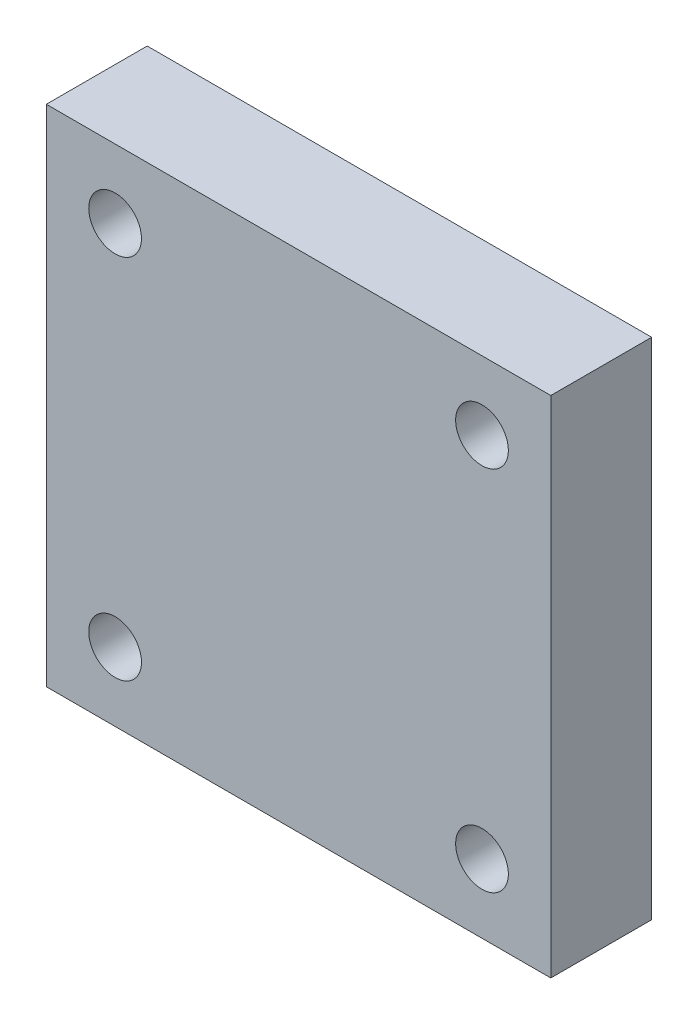
ISO-10303-21;
HEADER;
FILE_DESCRIPTION(('STEP AP214'),'2;1');
FILE_NAME('part.step','',(''),(''),'','','');
FILE_SCHEMA(('AUTOMOTIVE_DESIGN { 1 0 10303 214 1 1 1 1 }'));
ENDSEC;
DATA;
#1=APPLICATION_CONTEXT('core data for automotive mechanical design processes');
#2=APPLICATION_PROTOCOL_DEFINITION('international standard','automotive_design',2000,#1);
#3=PRODUCT_CONTEXT('',#1,'mechanical');
#4=PRODUCT('Part','Part','',(#3));
#5=PRODUCT_RELATED_PRODUCT_CATEGORY('part','',(#4));
#6=PRODUCT_DEFINITION_FORMATION('','',#4);
#7=PRODUCT_DEFINITION_CONTEXT('part definition',#1,'design');
#8=PRODUCT_DEFINITION('design','',#6,#7);
#9=PRODUCT_DEFINITION_SHAPE('','',#8);
#10=(LENGTH_UNIT() NAMED_UNIT(*) SI_UNIT(.MILLI.,.METRE.));
#11=(NAMED_UNIT(*) PLANE_ANGLE_UNIT() SI_UNIT($,.RADIAN.));
#12=(NAMED_UNIT(*) SI_UNIT($,.STERADIAN.) SOLID_ANGLE_UNIT());
#13=UNCERTAINTY_MEASURE_WITH_UNIT(LENGTH_MEASURE(1.E-05),#10,'distance_accuracy_value','');
#14=(GEOMETRIC_REPRESENTATION_CONTEXT(3) GLOBAL_UNCERTAINTY_ASSIGNED_CONTEXT((#13)) GLOBAL_UNIT_ASSIGNED_CONTEXT((#10,
#11,#12)) REPRESENTATION_CONTEXT('',''));
#15=CARTESIAN_POINT('',(0.,0.,0.));
#16=DIRECTION('',(0.,0.,1.));
#17=DIRECTION('',(1.,0.,0.));
#18=AXIS2_PLACEMENT_3D('',#15,#16,#17);
#19=CARTESIAN_POINT('',(0.,0.,5.588));
#20=DIRECTION('',(0.,0.,1.));
#21=DIRECTION('',(1.,0.,0.));
#22=AXIS2_PLACEMENT_3D('',#19,#20,#21);
#23=PLANE('',#22);
#24=CARTESIAN_POINT('',(10.16,-10.16,5.588));
#25=DIRECTION('',(0.,0.,1.));
#26=DIRECTION('',(-1.,0.,0.));
#27=AXIS2_PLACEMENT_3D('',#24,#25,#26);
#28=CIRCLE('',#27,1.4605);
#29=CARTESIAN_POINT('',(8.6995,-10.16,5.588));
#30=VERTEX_POINT('',#29);
#31=EDGE_CURVE('E148',#30,#30,#28,.T.);
#32=ORIENTED_EDGE('',*,*,#31,.F.);
#33=EDGE_LOOP('',(#32));
#34=FACE_BOUND('',#33,.T.);
#35=CARTESIAN_POINT('',(-10.16,-10.16,5.588));
#36=DIRECTION('',(0.,0.,1.));
#37=DIRECTION('',(1.,0.,0.));
#38=AXIS2_PLACEMENT_3D('',#35,#36,#37);
#39=CIRCLE('',#38,1.4605);
#40=CARTESIAN_POINT('',(-8.6995,-10.16,5.588));
#41=VERTEX_POINT('',#40);
#42=EDGE_CURVE('E118',#41,#41,#39,.T.);
#43=ORIENTED_EDGE('',*,*,#42,.F.);
#44=EDGE_LOOP('',(#43));
#45=FACE_BOUND('',#44,.T.);
#46=DIRECTION('',(1.,0.,0.));
#47=VECTOR('',#46,1.);
#48=CARTESIAN_POINT('',(13.97,-13.97,5.588));
#49=LINE('',#48,#47);
#50=CARTESIAN_POINT('',(-13.97,-13.97,5.588));
#51=VERTEX_POINT('',#50);
#52=CARTESIAN_POINT('',(13.97,-13.97,5.588));
#53=VERTEX_POINT('',#52);
#54=EDGE_CURVE('E98',#51,#53,#49,.T.);
#55=ORIENTED_EDGE('',*,*,#54,.T.);
#56=DIRECTION('',(0.,1.,0.));
#57=VECTOR('',#56,1.);
#58=CARTESIAN_POINT('',(13.97,13.97,5.588));
#59=LINE('',#58,#57);
#60=CARTESIAN_POINT('',(13.97,13.97,5.588));
#61=VERTEX_POINT('',#60);
#62=EDGE_CURVE('E93',#53,#61,#59,.T.);
#63=ORIENTED_EDGE('',*,*,#62,.T.);
#64=DIRECTION('',(-1.,0.,0.));
#65=VECTOR('',#64,1.);
#66=CARTESIAN_POINT('',(13.97,13.97,5.588));
#67=LINE('',#66,#65);
#68=CARTESIAN_POINT('',(-13.97,13.97,5.588));
#69=VERTEX_POINT('',#68);
#70=EDGE_CURVE('E96',#61,#69,#67,.T.);
#71=ORIENTED_EDGE('',*,*,#70,.T.);
#72=DIRECTION('',(0.,-1.,0.));
#73=VECTOR('',#72,1.);
#74=CARTESIAN_POINT('',(-13.97,13.97,5.588));
#75=LINE('',#74,#73);
#76=EDGE_CURVE('E63',#69,#51,#75,.T.);
#77=ORIENTED_EDGE('',*,*,#76,.T.);
#78=EDGE_LOOP('',(#55,#63,#71,#77));
#79=FACE_BOUND('',#78,.T.);
#80=CARTESIAN_POINT('',(-10.16,10.16,5.588));
#81=DIRECTION('',(0.,0.,1.));
#82=DIRECTION('',(-1.,0.,0.));
#83=AXIS2_PLACEMENT_3D('',#80,#81,#82);
#84=CIRCLE('',#83,1.4605);
#85=CARTESIAN_POINT('',(-11.6205,10.16,5.588));
#86=VERTEX_POINT('',#85);
#87=EDGE_CURVE('E140',#86,#86,#84,.T.);
#88=ORIENTED_EDGE('',*,*,#87,.F.);
#89=EDGE_LOOP('',(#88));
#90=FACE_BOUND('',#89,.T.);
#91=CARTESIAN_POINT('',(10.16,10.16,5.588));
#92=DIRECTION('',(0.,0.,1.));
#93=DIRECTION('',(1.,0.,0.));
#94=AXIS2_PLACEMENT_3D('',#91,#92,#93);
#95=CIRCLE('',#94,1.4605);
#96=CARTESIAN_POINT('',(11.6205,10.16,5.588));
#97=VERTEX_POINT('',#96);
#98=EDGE_CURVE('E156',#97,#97,#95,.T.);
#99=ORIENTED_EDGE('',*,*,#98,.F.);
#100=EDGE_LOOP('',(#99));
#101=FACE_BOUND('',#100,.T.);
#102=ADVANCED_FACE('F45',(#34,#45,#79,#90,#101),#23,.T.);
#103=CARTESIAN_POINT('',(0.,0.,0.));
#104=DIRECTION('',(0.,0.,1.));
#105=DIRECTION('',(1.,0.,0.));
#106=AXIS2_PLACEMENT_3D('',#103,#104,#105);
#107=PLANE('',#106);
#108=DIRECTION('',(1.,0.,0.));
#109=VECTOR('',#108,1.);
#110=CARTESIAN_POINT('',(13.97,-13.97,0.));
#111=LINE('',#110,#109);
#112=CARTESIAN_POINT('',(-13.97,-13.97,0.));
#113=VERTEX_POINT('',#112);
#114=CARTESIAN_POINT('',(13.97,-13.97,0.));
#115=VERTEX_POINT('',#114);
#116=EDGE_CURVE('E114',#113,#115,#111,.T.);
#117=ORIENTED_EDGE('',*,*,#116,.F.);
#118=DIRECTION('',(0.,-1.,0.));
#119=VECTOR('',#118,1.);
#120=CARTESIAN_POINT('',(-13.97,13.97,0.));
#121=LINE('',#120,#119);
#122=CARTESIAN_POINT('',(-13.97,13.97,0.));
#123=VERTEX_POINT('',#122);
#124=EDGE_CURVE('E86',#123,#113,#121,.T.);
#125=ORIENTED_EDGE('',*,*,#124,.F.);
#126=DIRECTION('',(-1.,0.,0.));
#127=VECTOR('',#126,1.);
#128=CARTESIAN_POINT('',(13.97,13.97,0.));
#129=LINE('',#128,#127);
#130=CARTESIAN_POINT('',(13.97,13.97,0.));
#131=VERTEX_POINT('',#130);
#132=EDGE_CURVE('E80',#131,#123,#129,.T.);
#133=ORIENTED_EDGE('',*,*,#132,.F.);
#134=DIRECTION('',(0.,1.,0.));
#135=VECTOR('',#134,1.);
#136=CARTESIAN_POINT('',(13.97,13.97,0.));
#137=LINE('',#136,#135);
#138=EDGE_CURVE('E103',#115,#131,#137,.T.);
#139=ORIENTED_EDGE('',*,*,#138,.F.);
#140=EDGE_LOOP('',(#117,#125,#133,#139));
#141=FACE_BOUND('',#140,.T.);
#142=CARTESIAN_POINT('',(-10.16,-10.16,0.));
#143=DIRECTION('',(0.,0.,1.));
#144=DIRECTION('',(1.,0.,0.));
#145=AXIS2_PLACEMENT_3D('',#142,#143,#144);
#146=CIRCLE('',#145,1.4605);
#147=CARTESIAN_POINT('',(-8.6995,-10.16,0.));
#148=VERTEX_POINT('',#147);
#149=EDGE_CURVE('E136',#148,#148,#146,.T.);
#150=ORIENTED_EDGE('',*,*,#149,.T.);
#151=EDGE_LOOP('',(#150));
#152=FACE_BOUND('',#151,.T.);
#153=CARTESIAN_POINT('',(-10.16,10.16,0.));
#154=DIRECTION('',(0.,0.,1.));
#155=DIRECTION('',(-1.,0.,0.));
#156=AXIS2_PLACEMENT_3D('',#153,#154,#155);
#157=CIRCLE('',#156,1.4605);
#158=CARTESIAN_POINT('',(-11.6205,10.16,0.));
#159=VERTEX_POINT('',#158);
#160=EDGE_CURVE('E144',#159,#159,#157,.T.);
#161=ORIENTED_EDGE('',*,*,#160,.T.);
#162=EDGE_LOOP('',(#161));
#163=FACE_BOUND('',#162,.T.);
#164=CARTESIAN_POINT('',(10.16,-10.16,0.));
#165=DIRECTION('',(0.,0.,1.));
#166=DIRECTION('',(-1.,0.,0.));
#167=AXIS2_PLACEMENT_3D('',#164,#165,#166);
#168=CIRCLE('',#167,1.4605);
#169=CARTESIAN_POINT('',(8.6995,-10.16,0.));
#170=VERTEX_POINT('',#169);
#171=EDGE_CURVE('E152',#170,#170,#168,.T.);
#172=ORIENTED_EDGE('',*,*,#171,.T.);
#173=EDGE_LOOP('',(#172));
#174=FACE_BOUND('',#173,.T.);
#175=CARTESIAN_POINT('',(10.16,10.16,0.));
#176=DIRECTION('',(0.,0.,1.));
#177=DIRECTION('',(1.,0.,0.));
#178=AXIS2_PLACEMENT_3D('',#175,#176,#177);
#179=CIRCLE('',#178,1.4605);
#180=CARTESIAN_POINT('',(11.6205,10.16,0.));
#181=VERTEX_POINT('',#180);
#182=EDGE_CURVE('E160',#181,#181,#179,.T.);
#183=ORIENTED_EDGE('',*,*,#182,.T.);
#184=EDGE_LOOP('',(#183));
#185=FACE_BOUND('',#184,.T.);
#186=ADVANCED_FACE('F131',(#141,#152,#163,#174,#185),#107,.F.);
#187=CARTESIAN_POINT('',(13.97,-13.97,5.588));
#188=DIRECTION('',(0.,1.,0.));
#189=DIRECTION('',(0.,0.,1.));
#190=AXIS2_PLACEMENT_3D('',#187,#188,#189);
#191=PLANE('',#190);
#192=ORIENTED_EDGE('',*,*,#116,.T.);
#193=DIRECTION('',(0.,0.,-1.));
#194=VECTOR('',#193,1.);
#195=CARTESIAN_POINT('',(13.97,-13.97,5.588));
#196=LINE('',#195,#194);
#197=EDGE_CURVE('E11',#53,#115,#196,.T.);
#198=ORIENTED_EDGE('',*,*,#197,.F.);
#199=ORIENTED_EDGE('',*,*,#54,.F.);
#200=DIRECTION('',(0.,0.,-1.));
#201=VECTOR('',#200,1.);
#202=CARTESIAN_POINT('',(-13.97,-13.97,5.588));
#203=LINE('',#202,#201);
#204=EDGE_CURVE('E110',#51,#113,#203,.T.);
#205=ORIENTED_EDGE('',*,*,#204,.T.);
#206=EDGE_LOOP('',(#192,#198,#199,#205));
#207=FACE_BOUND('',#206,.T.);
#208=ADVANCED_FACE('F47',(#207),#191,.F.);
#209=CARTESIAN_POINT('',(13.97,13.97,5.588));
#210=DIRECTION('',(-1.,0.,0.));
#211=DIRECTION('',(0.,0.,1.));
#212=AXIS2_PLACEMENT_3D('',#209,#210,#211);
#213=PLANE('',#212);
#214=ORIENTED_EDGE('',*,*,#138,.T.);
#215=DIRECTION('',(0.,0.,-1.));
#216=VECTOR('',#215,1.);
#217=CARTESIAN_POINT('',(13.97,13.97,5.588));
#218=LINE('',#217,#216);
#219=EDGE_CURVE('E55',#61,#131,#218,.T.);
#220=ORIENTED_EDGE('',*,*,#219,.F.);
#221=ORIENTED_EDGE('',*,*,#62,.F.);
#222=ORIENTED_EDGE('',*,*,#197,.T.);
#223=EDGE_LOOP('',(#214,#220,#221,#222));
#224=FACE_BOUND('',#223,.T.);
#225=ADVANCED_FACE('F102',(#224),#213,.F.);
#226=CARTESIAN_POINT('',(13.97,13.97,5.588));
#227=DIRECTION('',(0.,-1.,0.));
#228=DIRECTION('',(0.,0.,-1.));
#229=AXIS2_PLACEMENT_3D('',#226,#227,#228);
#230=PLANE('',#229);
#231=ORIENTED_EDGE('',*,*,#132,.T.);
#232=DIRECTION('',(0.,0.,-1.));
#233=VECTOR('',#232,1.);
#234=CARTESIAN_POINT('',(-13.97,13.97,5.588));
#235=LINE('',#234,#233);
#236=EDGE_CURVE('E105',#69,#123,#235,.T.);
#237=ORIENTED_EDGE('',*,*,#236,.F.);
#238=ORIENTED_EDGE('',*,*,#70,.F.);
#239=ORIENTED_EDGE('',*,*,#219,.T.);
#240=EDGE_LOOP('',(#231,#237,#238,#239));
#241=FACE_BOUND('',#240,.T.);
#242=ADVANCED_FACE('F106',(#241),#230,.F.);
#243=CARTESIAN_POINT('',(-13.97,13.97,5.588));
#244=DIRECTION('',(1.,0.,0.));
#245=DIRECTION('',(0.,0.,-1.));
#246=AXIS2_PLACEMENT_3D('',#243,#244,#245);
#247=PLANE('',#246);
#248=ORIENTED_EDGE('',*,*,#124,.T.);
#249=ORIENTED_EDGE('',*,*,#204,.F.);
#250=ORIENTED_EDGE('',*,*,#76,.F.);
#251=ORIENTED_EDGE('',*,*,#236,.T.);
#252=EDGE_LOOP('',(#248,#249,#250,#251));
#253=FACE_BOUND('',#252,.T.);
#254=ADVANCED_FACE('F128',(#253),#247,.F.);
#255=CARTESIAN_POINT('',(-10.16,-10.16,5.588));
#256=DIRECTION('',(0.,0.,-1.));
#257=DIRECTION('',(-1.,0.,0.));
#258=AXIS2_PLACEMENT_3D('',#255,#256,#257);
#259=CYLINDRICAL_SURFACE('',#258,1.4605);
#260=ORIENTED_EDGE('',*,*,#42,.T.);
#261=EDGE_LOOP('',(#260));
#262=FACE_BOUND('',#261,.T.);
#263=ORIENTED_EDGE('',*,*,#149,.F.);
#264=EDGE_LOOP('',(#263));
#265=FACE_BOUND('',#264,.T.);
#266=ADVANCED_FACE('F181',(#262,#265),#259,.F.);
#267=CARTESIAN_POINT('',(-10.16,10.16,5.588));
#268=DIRECTION('',(0.,0.,-1.));
#269=DIRECTION('',(-1.,0.,0.));
#270=AXIS2_PLACEMENT_3D('',#267,#268,#269);
#271=CYLINDRICAL_SURFACE('',#270,1.4605);
#272=ORIENTED_EDGE('',*,*,#87,.T.);
#273=EDGE_LOOP('',(#272));
#274=FACE_BOUND('',#273,.T.);
#275=ORIENTED_EDGE('',*,*,#160,.F.);
#276=EDGE_LOOP('',(#275));
#277=FACE_BOUND('',#276,.T.);
#278=ADVANCED_FACE('F226',(#274,#277),#271,.F.);
#279=CARTESIAN_POINT('',(10.16,-10.16,5.588));
#280=DIRECTION('',(0.,0.,-1.));
#281=DIRECTION('',(-1.,0.,0.));
#282=AXIS2_PLACEMENT_3D('',#279,#280,#281);
#283=CYLINDRICAL_SURFACE('',#282,1.4605);
#284=ORIENTED_EDGE('',*,*,#31,.T.);
#285=EDGE_LOOP('',(#284));
#286=FACE_BOUND('',#285,.T.);
#287=ORIENTED_EDGE('',*,*,#171,.F.);
#288=EDGE_LOOP('',(#287));
#289=FACE_BOUND('',#288,.T.);
#290=ADVANCED_FACE('F234',(#286,#289),#283,.F.);
#291=CARTESIAN_POINT('',(10.16,10.16,5.588));
#292=DIRECTION('',(0.,0.,-1.));
#293=DIRECTION('',(-1.,0.,0.));
#294=AXIS2_PLACEMENT_3D('',#291,#292,#293);
#295=CYLINDRICAL_SURFACE('',#294,1.4605);
#296=ORIENTED_EDGE('',*,*,#98,.T.);
#297=EDGE_LOOP('',(#296));
#298=FACE_BOUND('',#297,.T.);
#299=ORIENTED_EDGE('',*,*,#182,.F.);
#300=EDGE_LOOP('',(#299));
#301=FACE_BOUND('',#300,.T.);
#302=ADVANCED_FACE('F168',(#298,#301),#295,.F.);
#303=CLOSED_SHELL('',(#102,#186,#208,#225,#242,#254,#266,#278,#290,#302));
#304=MANIFOLD_SOLID_BREP('B2',#303);
#305=ADVANCED_BREP_SHAPE_REPRESENTATION('',(#18,#304),#14);
#306=SHAPE_DEFINITION_REPRESENTATION(#9,#305);
ENDSEC;
END-ISO-10303-21;
